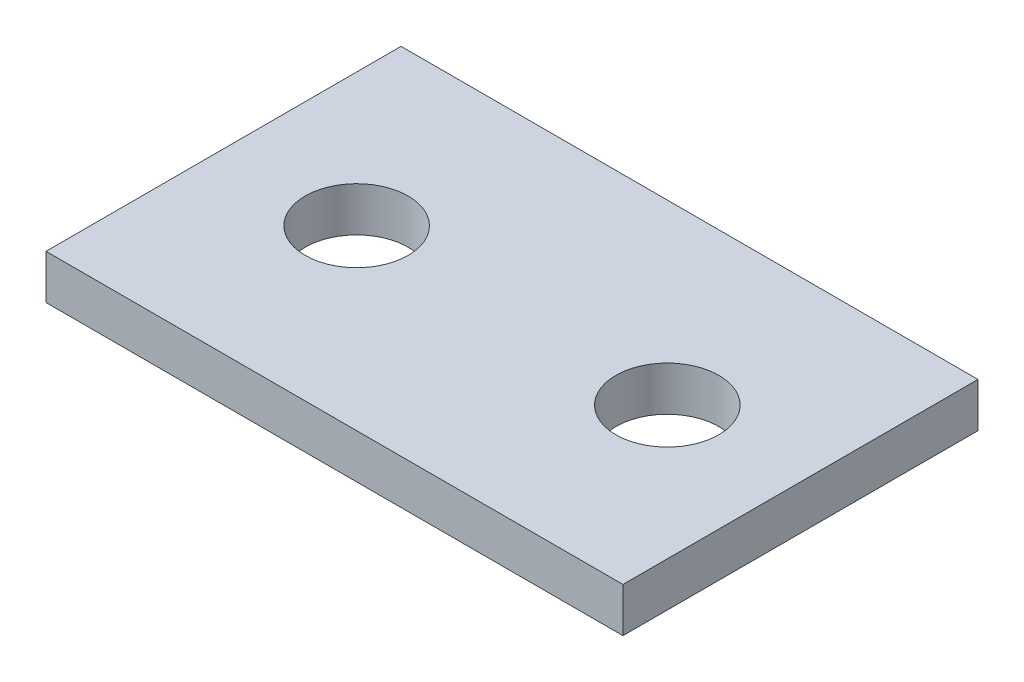
ISO-10303-21;
HEADER;
FILE_DESCRIPTION(('STEP AP214'),'2;1');
FILE_NAME('part.step','',(''),(''),'','','');
FILE_SCHEMA(('AUTOMOTIVE_DESIGN { 1 0 10303 214 1 1 1 1 }'));
ENDSEC;
DATA;
#1=APPLICATION_CONTEXT('core data for automotive mechanical design processes');
#2=APPLICATION_PROTOCOL_DEFINITION('international standard','automotive_design',2000,#1);
#3=PRODUCT_CONTEXT('',#1,'mechanical');
#4=PRODUCT('Part','Part','',(#3));
#5=PRODUCT_RELATED_PRODUCT_CATEGORY('part','',(#4));
#6=PRODUCT_DEFINITION_FORMATION('','',#4);
#7=PRODUCT_DEFINITION_CONTEXT('part definition',#1,'design');
#8=PRODUCT_DEFINITION('design','',#6,#7);
#9=PRODUCT_DEFINITION_SHAPE('','',#8);
#10=(LENGTH_UNIT() NAMED_UNIT(*) SI_UNIT(.MILLI.,.METRE.));
#11=(NAMED_UNIT(*) PLANE_ANGLE_UNIT() SI_UNIT($,.RADIAN.));
#12=(NAMED_UNIT(*) SI_UNIT($,.STERADIAN.) SOLID_ANGLE_UNIT());
#13=UNCERTAINTY_MEASURE_WITH_UNIT(LENGTH_MEASURE(1.E-05),#10,'distance_accuracy_value','');
#14=(GEOMETRIC_REPRESENTATION_CONTEXT(3) GLOBAL_UNCERTAINTY_ASSIGNED_CONTEXT((#13)) GLOBAL_UNIT_ASSIGNED_CONTEXT((#10,
#11,#12)) REPRESENTATION_CONTEXT('',''));
#15=CARTESIAN_POINT('',(0.,0.,0.));
#16=DIRECTION('',(0.,0.,1.));
#17=DIRECTION('',(1.,0.,0.));
#18=AXIS2_PLACEMENT_3D('',#15,#16,#17);
#19=CARTESIAN_POINT('',(41.275,3.175,25.4));
#20=DIRECTION('',(-1.,0.,0.));
#21=DIRECTION('',(0.,0.,1.));
#22=AXIS2_PLACEMENT_3D('',#19,#20,#21);
#23=PLANE('',#22);
#24=DIRECTION('',(0.,0.,-1.));
#25=VECTOR('',#24,1.);
#26=CARTESIAN_POINT('',(41.275,-3.175,25.4));
#27=LINE('',#26,#25);
#28=CARTESIAN_POINT('',(41.275,-3.175,25.4));
#29=VERTEX_POINT('',#28);
#30=CARTESIAN_POINT('',(41.275,-3.175,-25.4));
#31=VERTEX_POINT('',#30);
#32=EDGE_CURVE('E95',#29,#31,#27,.T.);
#33=ORIENTED_EDGE('',*,*,#32,.T.);
#34=DIRECTION('',(0.,-1.,0.));
#35=VECTOR('',#34,1.);
#36=CARTESIAN_POINT('',(41.275,3.175,-25.4));
#37=LINE('',#36,#35);
#38=CARTESIAN_POINT('',(41.275,3.175,-25.4));
#39=VERTEX_POINT('',#38);
#40=EDGE_CURVE('E11',#39,#31,#37,.T.);
#41=ORIENTED_EDGE('',*,*,#40,.F.);
#42=DIRECTION('',(0.,0.,-1.));
#43=VECTOR('',#42,1.);
#44=CARTESIAN_POINT('',(41.275,3.175,25.4));
#45=LINE('',#44,#43);
#46=CARTESIAN_POINT('',(41.275,3.175,25.4));
#47=VERTEX_POINT('',#46);
#48=EDGE_CURVE('E83',#47,#39,#45,.T.);
#49=ORIENTED_EDGE('',*,*,#48,.F.);
#50=DIRECTION('',(0.,-1.,0.));
#51=VECTOR('',#50,1.);
#52=CARTESIAN_POINT('',(41.275,3.175,25.4));
#53=LINE('',#52,#51);
#54=EDGE_CURVE('E91',#47,#29,#53,.T.);
#55=ORIENTED_EDGE('',*,*,#54,.T.);
#56=EDGE_LOOP('',(#33,#41,#49,#55));
#57=FACE_BOUND('',#56,.T.);
#58=ADVANCED_FACE('F32',(#57),#23,.F.);
#59=CARTESIAN_POINT('',(-41.275,3.175,-25.4));
#60=DIRECTION('',(0.,0.,1.));
#61=DIRECTION('',(1.,0.,0.));
#62=AXIS2_PLACEMENT_3D('',#59,#60,#61);
#63=PLANE('',#62);
#64=DIRECTION('',(-1.,0.,0.));
#65=VECTOR('',#64,1.);
#66=CARTESIAN_POINT('',(-41.275,-3.175,-25.4));
#67=LINE('',#66,#65);
#68=CARTESIAN_POINT('',(-41.275,-3.175,-25.4));
#69=VERTEX_POINT('',#68);
#70=EDGE_CURVE('E87',#31,#69,#67,.T.);
#71=ORIENTED_EDGE('',*,*,#70,.T.);
#72=DIRECTION('',(0.,-1.,0.));
#73=VECTOR('',#72,1.);
#74=CARTESIAN_POINT('',(-41.275,3.175,-25.4));
#75=LINE('',#74,#73);
#76=CARTESIAN_POINT('',(-41.275,3.175,-25.4));
#77=VERTEX_POINT('',#76);
#78=EDGE_CURVE('E40',#77,#69,#75,.T.);
#79=ORIENTED_EDGE('',*,*,#78,.F.);
#80=DIRECTION('',(-1.,0.,0.));
#81=VECTOR('',#80,1.);
#82=CARTESIAN_POINT('',(-41.275,3.175,-25.4));
#83=LINE('',#82,#81);
#84=EDGE_CURVE('E78',#39,#77,#83,.T.);
#85=ORIENTED_EDGE('',*,*,#84,.F.);
#86=ORIENTED_EDGE('',*,*,#40,.T.);
#87=EDGE_LOOP('',(#71,#79,#85,#86));
#88=FACE_BOUND('',#87,.T.);
#89=ADVANCED_FACE('F86',(#88),#63,.F.);
#90=CARTESIAN_POINT('',(-41.275,3.175,25.4));
#91=DIRECTION('',(1.,0.,0.));
#92=DIRECTION('',(0.,0.,-1.));
#93=AXIS2_PLACEMENT_3D('',#90,#91,#92);
#94=PLANE('',#93);
#95=DIRECTION('',(0.,0.,1.));
#96=VECTOR('',#95,1.);
#97=CARTESIAN_POINT('',(-41.275,-3.175,25.4));
#98=LINE('',#97,#96);
#99=CARTESIAN_POINT('',(-41.275,-3.175,25.4));
#100=VERTEX_POINT('',#99);
#101=EDGE_CURVE('E65',#69,#100,#98,.T.);
#102=ORIENTED_EDGE('',*,*,#101,.T.);
#103=DIRECTION('',(0.,-1.,0.));
#104=VECTOR('',#103,1.);
#105=CARTESIAN_POINT('',(-41.275,3.175,25.4));
#106=LINE('',#105,#104);
#107=CARTESIAN_POINT('',(-41.275,3.175,25.4));
#108=VERTEX_POINT('',#107);
#109=EDGE_CURVE('E88',#108,#100,#106,.T.);
#110=ORIENTED_EDGE('',*,*,#109,.F.);
#111=DIRECTION('',(0.,0.,1.));
#112=VECTOR('',#111,1.);
#113=CARTESIAN_POINT('',(-41.275,3.175,25.4));
#114=LINE('',#113,#112);
#115=EDGE_CURVE('E81',#77,#108,#114,.T.);
#116=ORIENTED_EDGE('',*,*,#115,.F.);
#117=ORIENTED_EDGE('',*,*,#78,.T.);
#118=EDGE_LOOP('',(#102,#110,#116,#117));
#119=FACE_BOUND('',#118,.T.);
#120=ADVANCED_FACE('F89',(#119),#94,.F.);
#121=CARTESIAN_POINT('',(-41.275,3.175,25.4));
#122=DIRECTION('',(0.,0.,-1.));
#123=DIRECTION('',(-1.,0.,0.));
#124=AXIS2_PLACEMENT_3D('',#121,#122,#123);
#125=PLANE('',#124);
#126=DIRECTION('',(1.,0.,0.));
#127=VECTOR('',#126,1.);
#128=CARTESIAN_POINT('',(-41.275,-3.175,25.4));
#129=LINE('',#128,#127);
#130=EDGE_CURVE('E71',#100,#29,#129,.T.);
#131=ORIENTED_EDGE('',*,*,#130,.T.);
#132=ORIENTED_EDGE('',*,*,#54,.F.);
#133=DIRECTION('',(1.,0.,0.));
#134=VECTOR('',#133,1.);
#135=CARTESIAN_POINT('',(-41.275,3.175,25.4));
#136=LINE('',#135,#134);
#137=EDGE_CURVE('E48',#108,#47,#136,.T.);
#138=ORIENTED_EDGE('',*,*,#137,.F.);
#139=ORIENTED_EDGE('',*,*,#109,.T.);
#140=EDGE_LOOP('',(#131,#132,#138,#139));
#141=FACE_BOUND('',#140,.T.);
#142=ADVANCED_FACE('F103',(#141),#125,.F.);
#143=CARTESIAN_POINT('',(0.,3.175,0.));
#144=DIRECTION('',(0.,-1.,0.));
#145=DIRECTION('',(0.,0.,-1.));
#146=AXIS2_PLACEMENT_3D('',#143,#144,#145);
#147=PLANE('',#146);
#148=CARTESIAN_POINT('',(-22.225,3.175,0.));
#149=DIRECTION('',(0.,1.,0.));
#150=DIRECTION('',(0.,0.,1.));
#151=AXIS2_PLACEMENT_3D('',#148,#149,#150);
#152=CIRCLE('',#151,7.366);
#153=CARTESIAN_POINT('',(-22.225,3.175,7.366));
#154=VERTEX_POINT('',#153);
#155=EDGE_CURVE('E117',#154,#154,#152,.T.);
#156=ORIENTED_EDGE('',*,*,#155,.F.);
#157=EDGE_LOOP('',(#156));
#158=FACE_BOUND('',#157,.T.);
#159=CARTESIAN_POINT('',(22.225,3.175,0.));
#160=DIRECTION('',(0.,1.,0.));
#161=DIRECTION('',(0.,0.,1.));
#162=AXIS2_PLACEMENT_3D('',#159,#160,#161);
#163=CIRCLE('',#162,7.366);
#164=CARTESIAN_POINT('',(22.225,3.175,7.36599999999999));
#165=VERTEX_POINT('',#164);
#166=EDGE_CURVE('E111',#165,#165,#163,.T.);
#167=ORIENTED_EDGE('',*,*,#166,.F.);
#168=EDGE_LOOP('',(#167));
#169=FACE_BOUND('',#168,.T.);
#170=ORIENTED_EDGE('',*,*,#48,.T.);
#171=ORIENTED_EDGE('',*,*,#84,.T.);
#172=ORIENTED_EDGE('',*,*,#115,.T.);
#173=ORIENTED_EDGE('',*,*,#137,.T.);
#174=EDGE_LOOP('',(#170,#171,#172,#173));
#175=FACE_BOUND('',#174,.T.);
#176=ADVANCED_FACE('F79',(#158,#169,#175),#147,.F.);
#177=CARTESIAN_POINT('',(0.,-3.175,0.));
#178=DIRECTION('',(0.,-1.,0.));
#179=DIRECTION('',(0.,0.,-1.));
#180=AXIS2_PLACEMENT_3D('',#177,#178,#179);
#181=PLANE('',#180);
#182=CARTESIAN_POINT('',(-22.225,-3.175,0.));
#183=DIRECTION('',(0.,1.,0.));
#184=DIRECTION('',(0.,0.,1.));
#185=AXIS2_PLACEMENT_3D('',#182,#183,#184);
#186=CIRCLE('',#185,7.366);
#187=CARTESIAN_POINT('',(-22.225,-3.175,7.366));
#188=VERTEX_POINT('',#187);
#189=EDGE_CURVE('E114',#188,#188,#186,.T.);
#190=ORIENTED_EDGE('',*,*,#189,.T.);
#191=EDGE_LOOP('',(#190));
#192=FACE_BOUND('',#191,.T.);
#193=CARTESIAN_POINT('',(22.225,-3.175,0.));
#194=DIRECTION('',(0.,1.,0.));
#195=DIRECTION('',(0.,0.,1.));
#196=AXIS2_PLACEMENT_3D('',#193,#194,#195);
#197=CIRCLE('',#196,7.36599999999999);
#198=CARTESIAN_POINT('',(22.225,-3.175,7.36599999999999));
#199=VERTEX_POINT('',#198);
#200=EDGE_CURVE('E98',#199,#199,#197,.T.);
#201=ORIENTED_EDGE('',*,*,#200,.T.);
#202=EDGE_LOOP('',(#201));
#203=FACE_BOUND('',#202,.T.);
#204=ORIENTED_EDGE('',*,*,#32,.F.);
#205=ORIENTED_EDGE('',*,*,#130,.F.);
#206=ORIENTED_EDGE('',*,*,#101,.F.);
#207=ORIENTED_EDGE('',*,*,#70,.F.);
#208=EDGE_LOOP('',(#204,#205,#206,#207));
#209=FACE_BOUND('',#208,.T.);
#210=ADVANCED_FACE('F106',(#192,#203,#209),#181,.T.);
#211=CARTESIAN_POINT('',(22.225,3.175,0.));
#212=DIRECTION('',(0.,1.,0.));
#213=DIRECTION('',(0.,0.,1.));
#214=AXIS2_PLACEMENT_3D('',#211,#212,#213);
#215=CYLINDRICAL_SURFACE('',#214,7.366);
#216=ORIENTED_EDGE('',*,*,#200,.F.);
#217=EDGE_LOOP('',(#216));
#218=FACE_BOUND('',#217,.T.);
#219=ORIENTED_EDGE('',*,*,#166,.T.);
#220=EDGE_LOOP('',(#219));
#221=FACE_BOUND('',#220,.T.);
#222=ADVANCED_FACE('F128',(#218,#221),#215,.F.);
#223=CARTESIAN_POINT('',(-22.225,3.175,0.));
#224=DIRECTION('',(0.,1.,0.));
#225=DIRECTION('',(0.,0.,1.));
#226=AXIS2_PLACEMENT_3D('',#223,#224,#225);
#227=CYLINDRICAL_SURFACE('',#226,7.366);
#228=ORIENTED_EDGE('',*,*,#189,.F.);
#229=EDGE_LOOP('',(#228));
#230=FACE_BOUND('',#229,.T.);
#231=ORIENTED_EDGE('',*,*,#155,.T.);
#232=EDGE_LOOP('',(#231));
#233=FACE_BOUND('',#232,.T.);
#234=ADVANCED_FACE('F121',(#230,#233),#227,.F.);
#235=CLOSED_SHELL('',(#58,#89,#120,#142,#176,#210,#222,#234));
#236=MANIFOLD_SOLID_BREP('B2',#235);
#237=ADVANCED_BREP_SHAPE_REPRESENTATION('',(#18,#236),#14);
#238=SHAPE_DEFINITION_REPRESENTATION(#9,#237);
ENDSEC;
END-ISO-10303-21;
